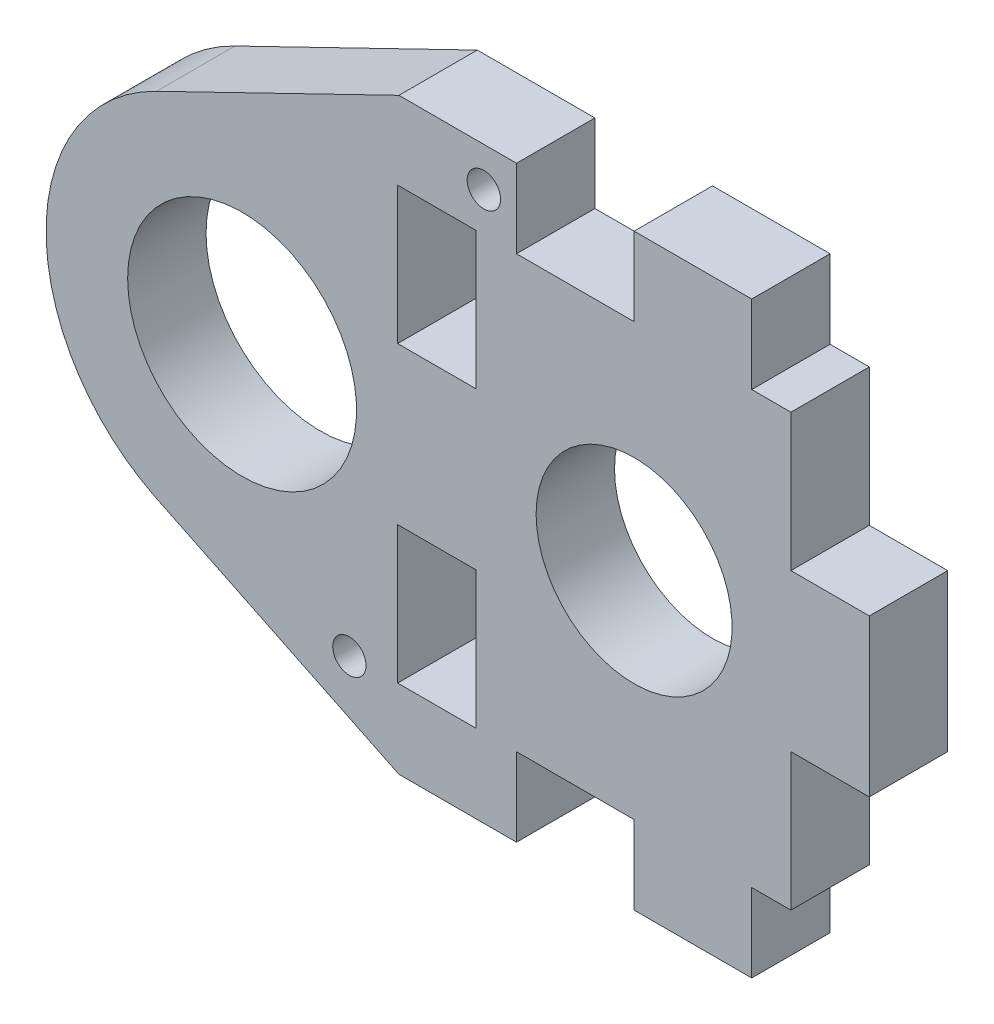
ISO-10303-21;
HEADER;
FILE_DESCRIPTION(('STEP AP214'),'2;1');
FILE_NAME('part.step','',(''),(''),'','','');
FILE_SCHEMA(('AUTOMOTIVE_DESIGN { 1 0 10303 214 1 1 1 1 }'));
ENDSEC;
DATA;
#1=APPLICATION_CONTEXT('core data for automotive mechanical design processes');
#2=APPLICATION_PROTOCOL_DEFINITION('international standard','automotive_design',2000,#1);
#3=PRODUCT_CONTEXT('',#1,'mechanical');
#4=PRODUCT('Part','Part','',(#3));
#5=PRODUCT_RELATED_PRODUCT_CATEGORY('part','',(#4));
#6=PRODUCT_DEFINITION_FORMATION('','',#4);
#7=PRODUCT_DEFINITION_CONTEXT('part definition',#1,'design');
#8=PRODUCT_DEFINITION('design','',#6,#7);
#9=PRODUCT_DEFINITION_SHAPE('','',#8);
#10=(LENGTH_UNIT() NAMED_UNIT(*) SI_UNIT(.MILLI.,.METRE.));
#11=(NAMED_UNIT(*) PLANE_ANGLE_UNIT() SI_UNIT($,.RADIAN.));
#12=(NAMED_UNIT(*) SI_UNIT($,.STERADIAN.) SOLID_ANGLE_UNIT());
#13=UNCERTAINTY_MEASURE_WITH_UNIT(LENGTH_MEASURE(1.E-05),#10,'distance_accuracy_value','');
#14=(GEOMETRIC_REPRESENTATION_CONTEXT(3) GLOBAL_UNCERTAINTY_ASSIGNED_CONTEXT((#13)) GLOBAL_UNIT_ASSIGNED_CONTEXT((#10,
#11,#12)) REPRESENTATION_CONTEXT('',''));
#15=CARTESIAN_POINT('',(0.,0.,0.));
#16=DIRECTION('',(0.,0.,1.));
#17=DIRECTION('',(1.,0.,0.));
#18=AXIS2_PLACEMENT_3D('',#15,#16,#17);
#19=CARTESIAN_POINT('',(-31.75,0.,0.));
#20=DIRECTION('',(0.,0.,1.));
#21=DIRECTION('',(1.,0.,0.));
#22=AXIS2_PLACEMENT_3D('',#19,#20,#21);
#23=PLANE('',#22);
#24=CARTESIAN_POINT('',(-23.0598523625735,-17.5213212412686,0.));
#25=DIRECTION('',(0.,0.,-1.));
#26=DIRECTION('',(-1.,0.,0.));
#27=AXIS2_PLACEMENT_3D('',#24,#25,#26);
#28=CIRCLE('',#27,1.35254999999999);
#29=CARTESIAN_POINT('',(-24.4124023625735,-17.5213212412686,0.));
#30=VERTEX_POINT('',#29);
#31=EDGE_CURVE('E480',#30,#30,#28,.T.);
#32=ORIENTED_EDGE('',*,*,#31,.F.);
#33=EDGE_LOOP('',(#32));
#34=FACE_BOUND('',#33,.T.);
#35=DIRECTION('',(-1.,0.,0.));
#36=VECTOR('',#35,1.);
#37=CARTESIAN_POINT('',(19.05,-6.34999999999999,5.13478148889135E-13));
#38=LINE('',#37,#36);
#39=CARTESIAN_POINT('',(19.05,-6.34999999999999,5.13478148889135E-13));
#40=VERTEX_POINT('',#39);
#41=CARTESIAN_POINT('',(12.7,-6.34999999999999,5.13478148889135E-13));
#42=VERTEX_POINT('',#41);
#43=EDGE_CURVE('E424',#40,#42,#38,.T.);
#44=ORIENTED_EDGE('',*,*,#43,.T.);
#45=DIRECTION('',(0.,1.,0.));
#46=VECTOR('',#45,1.);
#47=CARTESIAN_POINT('',(12.7,0.,0.));
#48=LINE('',#47,#46);
#49=CARTESIAN_POINT('',(12.7,-17.4625,0.));
#50=VERTEX_POINT('',#49);
#51=EDGE_CURVE('E399',#50,#42,#48,.T.);
#52=ORIENTED_EDGE('',*,*,#51,.F.);
#53=DIRECTION('',(1.,0.,0.));
#54=VECTOR('',#53,1.);
#55=CARTESIAN_POINT('',(9.52500000000002,-17.4625,0.));
#56=LINE('',#55,#54);
#57=CARTESIAN_POINT('',(9.52500000000002,-17.4625,0.));
#58=VERTEX_POINT('',#57);
#59=EDGE_CURVE('E349',#58,#50,#56,.T.);
#60=ORIENTED_EDGE('',*,*,#59,.F.);
#61=DIRECTION('',(0.,-1.,0.));
#62=VECTOR('',#61,1.);
#63=CARTESIAN_POINT('',(9.52500000000002,0.,0.));
#64=LINE('',#63,#62);
#65=CARTESIAN_POINT('',(9.52500000000001,-23.8125,0.));
#66=VERTEX_POINT('',#65);
#67=EDGE_CURVE('E272',#58,#66,#64,.T.);
#68=ORIENTED_EDGE('',*,*,#67,.T.);
#69=DIRECTION('',(1.,0.,0.));
#70=VECTOR('',#69,1.);
#71=CARTESIAN_POINT('',(-19.05,-23.8125,0.));
#72=LINE('',#71,#70);
#73=CARTESIAN_POINT('',(0.,-23.8125,0.));
#74=VERTEX_POINT('',#73);
#75=EDGE_CURVE('E292',#74,#66,#72,.T.);
#76=ORIENTED_EDGE('',*,*,#75,.F.);
#77=DIRECTION('',(0.,-1.,0.));
#78=VECTOR('',#77,1.);
#79=CARTESIAN_POINT('',(0.,-30.1625,0.));
#80=LINE('',#79,#78);
#81=CARTESIAN_POINT('',(0.,-17.4625,0.));
#82=VERTEX_POINT('',#81);
#83=EDGE_CURVE('E397',#82,#74,#80,.T.);
#84=ORIENTED_EDGE('',*,*,#83,.F.);
#85=DIRECTION('',(1.,0.,0.));
#86=VECTOR('',#85,1.);
#87=CARTESIAN_POINT('',(-9.52499999999998,-17.4625,0.));
#88=LINE('',#87,#86);
#89=CARTESIAN_POINT('',(-9.52499999999998,-17.4625,0.));
#90=VERTEX_POINT('',#89);
#91=EDGE_CURVE('E393',#90,#82,#88,.T.);
#92=ORIENTED_EDGE('',*,*,#91,.F.);
#93=DIRECTION('',(0.,-1.,0.));
#94=VECTOR('',#93,1.);
#95=CARTESIAN_POINT('',(-9.52499999999998,0.,0.));
#96=LINE('',#95,#94);
#97=CARTESIAN_POINT('',(-9.52499999999999,-23.8125,0.));
#98=VERTEX_POINT('',#97);
#99=EDGE_CURVE('E262',#90,#98,#96,.T.);
#100=ORIENTED_EDGE('',*,*,#99,.T.);
#101=CARTESIAN_POINT('',(-19.05,-23.8125,0.));
#102=VERTEX_POINT('',#101);
#103=EDGE_CURVE('E288',#102,#98,#72,.T.);
#104=ORIENTED_EDGE('',*,*,#103,.F.);
#105=DIRECTION('',(0.899591061172804,-0.436733239699006,0.));
#106=VECTOR('',#105,1.);
#107=CARTESIAN_POINT('',(-19.05,-23.8125,0.));
#108=LINE('',#107,#106);
#109=CARTESIAN_POINT('',(-38.6831401802217,-14.2810080961183,0.));
#110=VERTEX_POINT('',#109);
#111=EDGE_CURVE('E293',#110,#102,#108,.T.);
#112=ORIENTED_EDGE('',*,*,#111,.F.);
#113=CARTESIAN_POINT('',(-31.75,0.,0.));
#114=DIRECTION('',(0.,0.,1.));
#115=DIRECTION('',(1.,0.,0.));
#116=AXIS2_PLACEMENT_3D('',#113,#114,#115);
#117=CIRCLE('',#116,15.875);
#118=CARTESIAN_POINT('',(-38.6831401802217,14.2810080961183,0.));
#119=VERTEX_POINT('',#118);
#120=EDGE_CURVE('E295',#119,#110,#117,.T.);
#121=ORIENTED_EDGE('',*,*,#120,.F.);
#122=DIRECTION('',(-0.899591061172804,-0.436733239699006,0.));
#123=VECTOR('',#122,1.);
#124=CARTESIAN_POINT('',(-19.05,23.8125,0.));
#125=LINE('',#124,#123);
#126=CARTESIAN_POINT('',(-19.05,23.8125,0.));
#127=VERTEX_POINT('',#126);
#128=EDGE_CURVE('E297',#127,#119,#125,.T.);
#129=ORIENTED_EDGE('',*,*,#128,.F.);
#130=DIRECTION('',(-1.,0.,0.));
#131=VECTOR('',#130,1.);
#132=CARTESIAN_POINT('',(-19.05,23.8125,0.));
#133=LINE('',#132,#131);
#134=CARTESIAN_POINT('',(-9.52499999999998,23.8125,0.));
#135=VERTEX_POINT('',#134);
#136=EDGE_CURVE('E302',#135,#127,#133,.T.);
#137=ORIENTED_EDGE('',*,*,#136,.F.);
#138=DIRECTION('',(0.,1.,0.));
#139=VECTOR('',#138,1.);
#140=CARTESIAN_POINT('',(-9.52499999999998,17.4625,0.));
#141=LINE('',#140,#139);
#142=CARTESIAN_POINT('',(-9.52499999999998,17.4625,0.));
#143=VERTEX_POINT('',#142);
#144=EDGE_CURVE('E368',#143,#135,#141,.T.);
#145=ORIENTED_EDGE('',*,*,#144,.F.);
#146=DIRECTION('',(-1.,0.,0.));
#147=VECTOR('',#146,1.);
#148=CARTESIAN_POINT('',(-9.52499999999998,17.4625,0.));
#149=LINE('',#148,#147);
#150=CARTESIAN_POINT('',(0.,17.4625,0.));
#151=VERTEX_POINT('',#150);
#152=EDGE_CURVE('E371',#151,#143,#149,.T.);
#153=ORIENTED_EDGE('',*,*,#152,.F.);
#154=DIRECTION('',(0.,1.,0.));
#155=VECTOR('',#154,1.);
#156=CARTESIAN_POINT('',(0.,0.,0.));
#157=LINE('',#156,#155);
#158=CARTESIAN_POINT('',(0.,23.8125,0.));
#159=VERTEX_POINT('',#158);
#160=EDGE_CURVE('E267',#151,#159,#157,.T.);
#161=ORIENTED_EDGE('',*,*,#160,.T.);
#162=CARTESIAN_POINT('',(9.52500000000002,23.8125,0.));
#163=VERTEX_POINT('',#162);
#164=EDGE_CURVE('E299',#163,#159,#133,.T.);
#165=ORIENTED_EDGE('',*,*,#164,.F.);
#166=DIRECTION('',(0.,1.,0.));
#167=VECTOR('',#166,1.);
#168=CARTESIAN_POINT('',(9.52500000000002,17.4625,0.));
#169=LINE('',#168,#167);
#170=CARTESIAN_POINT('',(9.52500000000002,17.4625,0.));
#171=VERTEX_POINT('',#170);
#172=EDGE_CURVE('E334',#171,#163,#169,.T.);
#173=ORIENTED_EDGE('',*,*,#172,.F.);
#174=DIRECTION('',(-1.,0.,0.));
#175=VECTOR('',#174,1.);
#176=CARTESIAN_POINT('',(9.52500000000002,17.4625,0.));
#177=LINE('',#176,#175);
#178=CARTESIAN_POINT('',(12.7,17.4625,0.));
#179=VERTEX_POINT('',#178);
#180=EDGE_CURVE('E337',#179,#171,#177,.T.);
#181=ORIENTED_EDGE('',*,*,#180,.F.);
#182=CARTESIAN_POINT('',(12.7,6.35000000000001,5.13478148889135E-13));
#183=VERTEX_POINT('',#182);
#184=EDGE_CURVE('E407',#183,#179,#48,.T.);
#185=ORIENTED_EDGE('',*,*,#184,.F.);
#186=DIRECTION('',(-1.,0.,0.));
#187=VECTOR('',#186,1.);
#188=CARTESIAN_POINT('',(19.05,6.35000000000001,5.13478148889135E-13));
#189=LINE('',#188,#187);
#190=CARTESIAN_POINT('',(19.05,6.35000000000001,5.13478148889135E-13));
#191=VERTEX_POINT('',#190);
#192=EDGE_CURVE('E425',#191,#183,#189,.T.);
#193=ORIENTED_EDGE('',*,*,#192,.F.);
#194=DIRECTION('',(0.,1.,0.));
#195=VECTOR('',#194,1.);
#196=CARTESIAN_POINT('',(19.05,-23.8125,0.));
#197=LINE('',#196,#195);
#198=EDGE_CURVE('E303',#40,#191,#197,.T.);
#199=ORIENTED_EDGE('',*,*,#198,.F.);
#200=EDGE_LOOP('',(#44,#52,#60,#68,#76,#84,#92,#100,#104,#112,#121,#129,#137,#145,#153,#161,
#165,#173,#181,#185,#193,#199));
#201=FACE_BOUND('',#200,.T.);
#202=CARTESIAN_POINT('',(-31.75,0.,0.));
#203=DIRECTION('',(0.,0.,-1.));
#204=DIRECTION('',(-1.,0.,0.));
#205=AXIS2_PLACEMENT_3D('',#202,#203,#204);
#206=CIRCLE('',#205,9.271);
#207=CARTESIAN_POINT('',(-41.021,0.,0.));
#208=VERTEX_POINT('',#207);
#209=EDGE_CURVE('E322',#208,#208,#206,.T.);
#210=ORIENTED_EDGE('',*,*,#209,.F.);
#211=EDGE_LOOP('',(#210));
#212=FACE_BOUND('',#211,.T.);
#213=DIRECTION('',(-1.,0.,0.));
#214=VECTOR('',#213,1.);
#215=CARTESIAN_POINT('',(-12.8015999999999,-6.35000000000003,5.55111512312578E-13));
#216=LINE('',#215,#214);
#217=CARTESIAN_POINT('',(-12.8015999999999,-6.35000000000003,5.55111512312578E-13));
#218=VERTEX_POINT('',#217);
#219=CARTESIAN_POINT('',(-19.1515999999999,-6.35000000000004,0.));
#220=VERTEX_POINT('',#219);
#221=EDGE_CURVE('E234',#218,#220,#216,.T.);
#222=ORIENTED_EDGE('',*,*,#221,.T.);
#223=DIRECTION('',(0.,1.,0.));
#224=VECTOR('',#223,1.);
#225=CARTESIAN_POINT('',(-19.1515999999999,0.,0.));
#226=LINE('',#225,#224);
#227=CARTESIAN_POINT('',(-19.1515999999999,-17.4625,0.));
#228=VERTEX_POINT('',#227);
#229=EDGE_CURVE('E11',#228,#220,#226,.T.);
#230=ORIENTED_EDGE('',*,*,#229,.F.);
#231=DIRECTION('',(-1.,0.,0.));
#232=VECTOR('',#231,1.);
#233=CARTESIAN_POINT('',(-31.75,-17.4625,0.));
#234=LINE('',#233,#232);
#235=CARTESIAN_POINT('',(-12.8015999999999,-17.4625,0.));
#236=VERTEX_POINT('',#235);
#237=EDGE_CURVE('E43',#236,#228,#234,.T.);
#238=ORIENTED_EDGE('',*,*,#237,.F.);
#239=DIRECTION('',(0.,1.,0.));
#240=VECTOR('',#239,1.);
#241=CARTESIAN_POINT('',(-12.8015999999999,0.,0.));
#242=LINE('',#241,#240);
#243=EDGE_CURVE('E247',#236,#218,#242,.T.);
#244=ORIENTED_EDGE('',*,*,#243,.T.);
#245=EDGE_LOOP('',(#222,#230,#238,#244));
#246=FACE_BOUND('',#245,.T.);
#247=CARTESIAN_POINT('',(-19.1515999999999,6.34999999999996,5.55111512312578E-13));
#248=VERTEX_POINT('',#247);
#249=CARTESIAN_POINT('',(-19.1515999999999,17.4625,0.));
#250=VERTEX_POINT('',#249);
#251=EDGE_CURVE('E45',#248,#250,#226,.T.);
#252=ORIENTED_EDGE('',*,*,#251,.F.);
#253=DIRECTION('',(-1.,0.,0.));
#254=VECTOR('',#253,1.);
#255=CARTESIAN_POINT('',(-12.8015999999999,6.34999999999997,5.55111512312578E-13));
#256=LINE('',#255,#254);
#257=CARTESIAN_POINT('',(-12.8015999999999,6.34999999999997,0.));
#258=VERTEX_POINT('',#257);
#259=EDGE_CURVE('E244',#258,#248,#256,.T.);
#260=ORIENTED_EDGE('',*,*,#259,.F.);
#261=CARTESIAN_POINT('',(-12.8015999999999,17.4625,0.));
#262=VERTEX_POINT('',#261);
#263=EDGE_CURVE('E254',#258,#262,#242,.T.);
#264=ORIENTED_EDGE('',*,*,#263,.T.);
#265=DIRECTION('',(1.,0.,0.));
#266=VECTOR('',#265,1.);
#267=CARTESIAN_POINT('',(-31.75,17.4625,0.));
#268=LINE('',#267,#266);
#269=EDGE_CURVE('E252',#250,#262,#268,.T.);
#270=ORIENTED_EDGE('',*,*,#269,.F.);
#271=EDGE_LOOP('',(#252,#260,#264,#270));
#272=FACE_BOUND('',#271,.T.);
#273=CARTESIAN_POINT('',(0.,0.,0.));
#274=DIRECTION('',(0.,0.,-1.));
#275=DIRECTION('',(-1.,0.,0.));
#276=AXIS2_PLACEMENT_3D('',#273,#274,#275);
#277=CIRCLE('',#276,7.9375);
#278=CARTESIAN_POINT('',(-7.93749999999998,0.,0.));
#279=VERTEX_POINT('',#278);
#280=EDGE_CURVE('E469',#279,#279,#277,.T.);
#281=ORIENTED_EDGE('',*,*,#280,.F.);
#282=EDGE_LOOP('',(#281));
#283=FACE_BOUND('',#282,.T.);
#284=CARTESIAN_POINT('',(-12.169849394093,20.6375,0.));
#285=DIRECTION('',(0.,0.,-1.));
#286=DIRECTION('',(-1.,0.,0.));
#287=AXIS2_PLACEMENT_3D('',#284,#285,#286);
#288=CIRCLE('',#287,1.35254999999999);
#289=CARTESIAN_POINT('',(-13.522399394093,20.6375,0.));
#290=VERTEX_POINT('',#289);
#291=EDGE_CURVE('E477',#290,#290,#288,.T.);
#292=ORIENTED_EDGE('',*,*,#291,.F.);
#293=EDGE_LOOP('',(#292));
#294=FACE_BOUND('',#293,.T.);
#295=ADVANCED_FACE('F34',(#34,#201,#212,#246,#272,#283,#294),#23,.F.);
#296=CARTESIAN_POINT('',(-31.75,0.,6.35));
#297=DIRECTION('',(0.,0.,1.));
#298=DIRECTION('',(1.,0.,0.));
#299=AXIS2_PLACEMENT_3D('',#296,#297,#298);
#300=PLANE('',#299);
#301=CARTESIAN_POINT('',(-23.0598523625735,-17.5213212412686,6.35));
#302=DIRECTION('',(0.,0.,1.));
#303=DIRECTION('',(1.,0.,0.));
#304=AXIS2_PLACEMENT_3D('',#301,#302,#303);
#305=CIRCLE('',#304,1.35254999999998);
#306=CARTESIAN_POINT('',(-21.7073023625735,-17.5213212412686,6.35));
#307=VERTEX_POINT('',#306);
#308=EDGE_CURVE('E38',#307,#307,#305,.T.);
#309=ORIENTED_EDGE('',*,*,#308,.F.);
#310=EDGE_LOOP('',(#309));
#311=FACE_BOUND('',#310,.T.);
#312=CARTESIAN_POINT('',(-12.169849394093,20.6375,6.35));
#313=DIRECTION('',(0.,0.,1.));
#314=DIRECTION('',(1.,0.,0.));
#315=AXIS2_PLACEMENT_3D('',#312,#313,#314);
#316=CIRCLE('',#315,1.35254999999998);
#317=CARTESIAN_POINT('',(-10.817299394093,20.6375,6.35));
#318=VERTEX_POINT('',#317);
#319=EDGE_CURVE('E472',#318,#318,#316,.T.);
#320=ORIENTED_EDGE('',*,*,#319,.F.);
#321=EDGE_LOOP('',(#320));
#322=FACE_BOUND('',#321,.T.);
#323=CARTESIAN_POINT('',(0.,0.,6.35000000000056));
#324=DIRECTION('',(0.,0.,-1.));
#325=DIRECTION('',(-1.,0.,0.));
#326=AXIS2_PLACEMENT_3D('',#323,#324,#325);
#327=CIRCLE('',#326,7.9375);
#328=CARTESIAN_POINT('',(-7.93749999999998,0.,6.35000000000056));
#329=VERTEX_POINT('',#328);
#330=EDGE_CURVE('E467',#329,#329,#327,.T.);
#331=ORIENTED_EDGE('',*,*,#330,.T.);
#332=EDGE_LOOP('',(#331));
#333=FACE_BOUND('',#332,.T.);
#334=DIRECTION('',(0.,1.,0.));
#335=VECTOR('',#334,1.);
#336=CARTESIAN_POINT('',(-19.1515999999999,-17.4625,6.35000000000056));
#337=LINE('',#336,#335);
#338=CARTESIAN_POINT('',(-19.1515999999999,6.34999999999996,6.35));
#339=VERTEX_POINT('',#338);
#340=CARTESIAN_POINT('',(-19.1515999999999,17.4625,6.35000000000056));
#341=VERTEX_POINT('',#340);
#342=EDGE_CURVE('E60',#339,#341,#337,.T.);
#343=ORIENTED_EDGE('',*,*,#342,.T.);
#344=DIRECTION('',(1.,0.,0.));
#345=VECTOR('',#344,1.);
#346=CARTESIAN_POINT('',(-19.1515999999999,17.4625,6.35000000000056));
#347=LINE('',#346,#345);
#348=CARTESIAN_POINT('',(-12.8015999999999,17.4625,6.35000000000056));
#349=VERTEX_POINT('',#348);
#350=EDGE_CURVE('E438',#341,#349,#347,.T.);
#351=ORIENTED_EDGE('',*,*,#350,.T.);
#352=DIRECTION('',(0.,1.,0.));
#353=VECTOR('',#352,1.);
#354=CARTESIAN_POINT('',(-12.8015999999999,-17.4625,6.35000000000056));
#355=LINE('',#354,#353);
#356=CARTESIAN_POINT('',(-12.8015999999999,6.34999999999997,6.35000000000056));
#357=VERTEX_POINT('',#356);
#358=EDGE_CURVE('E451',#357,#349,#355,.T.);
#359=ORIENTED_EDGE('',*,*,#358,.F.);
#360=DIRECTION('',(1.,0.,0.));
#361=VECTOR('',#360,1.);
#362=CARTESIAN_POINT('',(-19.1515999999999,6.34999999999997,6.35000000000056));
#363=LINE('',#362,#361);
#364=EDGE_CURVE('E243',#339,#357,#363,.T.);
#365=ORIENTED_EDGE('',*,*,#364,.F.);
#366=EDGE_LOOP('',(#343,#351,#359,#365));
#367=FACE_BOUND('',#366,.T.);
#368=CARTESIAN_POINT('',(-31.75,0.,6.35));
#369=DIRECTION('',(0.,0.,-1.));
#370=DIRECTION('',(-1.,0.,0.));
#371=AXIS2_PLACEMENT_3D('',#368,#369,#370);
#372=CIRCLE('',#371,9.271);
#373=CARTESIAN_POINT('',(-41.021,0.,6.35));
#374=VERTEX_POINT('',#373);
#375=EDGE_CURVE('E306',#374,#374,#372,.T.);
#376=ORIENTED_EDGE('',*,*,#375,.T.);
#377=EDGE_LOOP('',(#376));
#378=FACE_BOUND('',#377,.T.);
#379=DIRECTION('',(1.,0.,0.));
#380=VECTOR('',#379,1.);
#381=CARTESIAN_POINT('',(9.52500000000002,-17.4625,6.35));
#382=LINE('',#381,#380);
#383=CARTESIAN_POINT('',(9.52500000000002,-17.4625,6.35));
#384=VERTEX_POINT('',#383);
#385=CARTESIAN_POINT('',(12.7000000000001,-17.4625,6.35));
#386=VERTEX_POINT('',#385);
#387=EDGE_CURVE('E348',#384,#386,#382,.T.);
#388=ORIENTED_EDGE('',*,*,#387,.T.);
#389=DIRECTION('',(0.,1.,0.));
#390=VECTOR('',#389,1.);
#391=CARTESIAN_POINT('',(12.7,-17.4625,6.35000000000052));
#392=LINE('',#391,#390);
#393=CARTESIAN_POINT('',(12.7,-6.34999999999999,6.35000000000052));
#394=VERTEX_POINT('',#393);
#395=EDGE_CURVE('E415',#386,#394,#392,.T.);
#396=ORIENTED_EDGE('',*,*,#395,.T.);
#397=DIRECTION('',(-1.,0.,0.));
#398=VECTOR('',#397,1.);
#399=CARTESIAN_POINT('',(12.7,-6.34999999999999,6.35000000000052));
#400=LINE('',#399,#398);
#401=CARTESIAN_POINT('',(19.05,-6.34999999999999,6.35000000000052));
#402=VERTEX_POINT('',#401);
#403=EDGE_CURVE('E419',#402,#394,#400,.T.);
#404=ORIENTED_EDGE('',*,*,#403,.F.);
#405=DIRECTION('',(0.,1.,0.));
#406=VECTOR('',#405,1.);
#407=CARTESIAN_POINT('',(19.05,-23.8125,6.35));
#408=LINE('',#407,#406);
#409=CARTESIAN_POINT('',(19.05,6.35000000000001,6.35000000000052));
#410=VERTEX_POINT('',#409);
#411=EDGE_CURVE('E291',#402,#410,#408,.T.);
#412=ORIENTED_EDGE('',*,*,#411,.T.);
#413=DIRECTION('',(1.,0.,0.));
#414=VECTOR('',#413,1.);
#415=CARTESIAN_POINT('',(12.7,6.35000000000001,6.35000000000052));
#416=LINE('',#415,#414);
#417=CARTESIAN_POINT('',(12.7,6.35000000000001,6.35000000000052));
#418=VERTEX_POINT('',#417);
#419=EDGE_CURVE('E422',#418,#410,#416,.T.);
#420=ORIENTED_EDGE('',*,*,#419,.F.);
#421=CARTESIAN_POINT('',(12.7,17.4625,6.35000000000052));
#422=VERTEX_POINT('',#421);
#423=EDGE_CURVE('E418',#418,#422,#392,.T.);
#424=ORIENTED_EDGE('',*,*,#423,.T.);
#425=DIRECTION('',(-1.,0.,0.));
#426=VECTOR('',#425,1.);
#427=CARTESIAN_POINT('',(9.52500000000002,17.4625,6.35));
#428=LINE('',#427,#426);
#429=CARTESIAN_POINT('',(9.52500000000002,17.4625,6.35));
#430=VERTEX_POINT('',#429);
#431=EDGE_CURVE('E336',#422,#430,#428,.T.);
#432=ORIENTED_EDGE('',*,*,#431,.T.);
#433=DIRECTION('',(0.,1.,0.));
#434=VECTOR('',#433,1.);
#435=CARTESIAN_POINT('',(9.52500000000002,17.4625,6.35));
#436=LINE('',#435,#434);
#437=CARTESIAN_POINT('',(9.52500000000002,23.8125,6.35));
#438=VERTEX_POINT('',#437);
#439=EDGE_CURVE('E333',#430,#438,#436,.T.);
#440=ORIENTED_EDGE('',*,*,#439,.T.);
#441=DIRECTION('',(-1.,0.,0.));
#442=VECTOR('',#441,1.);
#443=CARTESIAN_POINT('',(-19.05,23.8125,6.35));
#444=LINE('',#443,#442);
#445=CARTESIAN_POINT('',(0.,23.8125,6.35));
#446=VERTEX_POINT('',#445);
#447=EDGE_CURVE('E316',#438,#446,#444,.T.);
#448=ORIENTED_EDGE('',*,*,#447,.T.);
#449=DIRECTION('',(0.,-1.,0.));
#450=VECTOR('',#449,1.);
#451=CARTESIAN_POINT('',(0.,17.4625,6.35));
#452=LINE('',#451,#450);
#453=CARTESIAN_POINT('',(0.,17.4625,6.35));
#454=VERTEX_POINT('',#453);
#455=EDGE_CURVE('E370',#446,#454,#452,.T.);
#456=ORIENTED_EDGE('',*,*,#455,.T.);
#457=DIRECTION('',(-1.,0.,0.));
#458=VECTOR('',#457,1.);
#459=CARTESIAN_POINT('',(-9.52499999999998,17.4625,6.35));
#460=LINE('',#459,#458);
#461=CARTESIAN_POINT('',(-9.52499999999998,17.4625,6.35));
#462=VERTEX_POINT('',#461);
#463=EDGE_CURVE('E377',#454,#462,#460,.T.);
#464=ORIENTED_EDGE('',*,*,#463,.T.);
#465=DIRECTION('',(0.,1.,0.));
#466=VECTOR('',#465,1.);
#467=CARTESIAN_POINT('',(-9.52499999999998,17.4625,6.35));
#468=LINE('',#467,#466);
#469=CARTESIAN_POINT('',(-9.52499999999998,23.8125,6.35));
#470=VERTEX_POINT('',#469);
#471=EDGE_CURVE('E366',#462,#470,#468,.T.);
#472=ORIENTED_EDGE('',*,*,#471,.T.);
#473=CARTESIAN_POINT('',(-19.05,23.8125,6.35));
#474=VERTEX_POINT('',#473);
#475=EDGE_CURVE('E319',#470,#474,#444,.T.);
#476=ORIENTED_EDGE('',*,*,#475,.T.);
#477=DIRECTION('',(-0.899591061172804,-0.436733239699006,0.));
#478=VECTOR('',#477,1.);
#479=CARTESIAN_POINT('',(-19.05,23.8125,6.35));
#480=LINE('',#479,#478);
#481=CARTESIAN_POINT('',(-38.6831401802217,14.2810080961183,6.35));
#482=VERTEX_POINT('',#481);
#483=EDGE_CURVE('E314',#474,#482,#480,.T.);
#484=ORIENTED_EDGE('',*,*,#483,.T.);
#485=CARTESIAN_POINT('',(-31.75,0.,6.35));
#486=DIRECTION('',(0.,0.,1.));
#487=DIRECTION('',(1.,0.,0.));
#488=AXIS2_PLACEMENT_3D('',#485,#486,#487);
#489=CIRCLE('',#488,15.875);
#490=CARTESIAN_POINT('',(-38.6831401802217,-14.2810080961183,6.35));
#491=VERTEX_POINT('',#490);
#492=EDGE_CURVE('E312',#482,#491,#489,.T.);
#493=ORIENTED_EDGE('',*,*,#492,.T.);
#494=DIRECTION('',(0.899591061172804,-0.436733239699006,0.));
#495=VECTOR('',#494,1.);
#496=CARTESIAN_POINT('',(-19.05,-23.8125,6.35));
#497=LINE('',#496,#495);
#498=CARTESIAN_POINT('',(-19.05,-23.8125,6.35));
#499=VERTEX_POINT('',#498);
#500=EDGE_CURVE('E310',#491,#499,#497,.T.);
#501=ORIENTED_EDGE('',*,*,#500,.T.);
#502=DIRECTION('',(1.,0.,0.));
#503=VECTOR('',#502,1.);
#504=CARTESIAN_POINT('',(-19.05,-23.8125,6.35));
#505=LINE('',#504,#503);
#506=CARTESIAN_POINT('',(-9.52499999999998,-23.8125,6.35));
#507=VERTEX_POINT('',#506);
#508=EDGE_CURVE('E287',#499,#507,#505,.T.);
#509=ORIENTED_EDGE('',*,*,#508,.T.);
#510=DIRECTION('',(0.,1.,0.));
#511=VECTOR('',#510,1.);
#512=CARTESIAN_POINT('',(-9.52499999999998,-30.1625,6.35));
#513=LINE('',#512,#511);
#514=CARTESIAN_POINT('',(-9.52499999999998,-17.4625,6.35));
#515=VERTEX_POINT('',#514);
#516=EDGE_CURVE('E402',#507,#515,#513,.T.);
#517=ORIENTED_EDGE('',*,*,#516,.T.);
#518=DIRECTION('',(1.,0.,0.));
#519=VECTOR('',#518,1.);
#520=CARTESIAN_POINT('',(-9.52499999999998,-17.4625,6.35));
#521=LINE('',#520,#519);
#522=CARTESIAN_POINT('',(0.,-17.4625,6.35));
#523=VERTEX_POINT('',#522);
#524=EDGE_CURVE('E391',#515,#523,#521,.T.);
#525=ORIENTED_EDGE('',*,*,#524,.T.);
#526=DIRECTION('',(0.,-1.,0.));
#527=VECTOR('',#526,1.);
#528=CARTESIAN_POINT('',(0.,-30.1625,6.35));
#529=LINE('',#528,#527);
#530=CARTESIAN_POINT('',(0.,-23.8125,6.35));
#531=VERTEX_POINT('',#530);
#532=EDGE_CURVE('E396',#523,#531,#529,.T.);
#533=ORIENTED_EDGE('',*,*,#532,.T.);
#534=CARTESIAN_POINT('',(9.52500000000002,-23.8125,6.35));
#535=VERTEX_POINT('',#534);
#536=EDGE_CURVE('E309',#531,#535,#505,.T.);
#537=ORIENTED_EDGE('',*,*,#536,.T.);
#538=DIRECTION('',(0.,1.,0.));
#539=VECTOR('',#538,1.);
#540=CARTESIAN_POINT('',(9.52500000000002,-30.1625,6.35));
#541=LINE('',#540,#539);
#542=EDGE_CURVE('E352',#535,#384,#541,.T.);
#543=ORIENTED_EDGE('',*,*,#542,.T.);
#544=EDGE_LOOP('',(#388,#396,#404,#412,#420,#424,#432,#440,#448,#456,#464,#472,#476,#484,#493,
#501,#509,#517,#525,#533,#537,#543));
#545=FACE_BOUND('',#544,.T.);
#546=CARTESIAN_POINT('',(-12.8015999999999,-17.4625,6.35000000000056));
#547=VERTEX_POINT('',#546);
#548=CARTESIAN_POINT('',(-12.8015999999999,-6.35000000000003,6.35));
#549=VERTEX_POINT('',#548);
#550=EDGE_CURVE('E52',#547,#549,#355,.T.);
#551=ORIENTED_EDGE('',*,*,#550,.F.);
#552=DIRECTION('',(1.,0.,0.));
#553=VECTOR('',#552,1.);
#554=CARTESIAN_POINT('',(-19.1515999999999,-17.4625,6.35000000000056));
#555=LINE('',#554,#553);
#556=CARTESIAN_POINT('',(-19.1515999999999,-17.4625,6.35000000000056));
#557=VERTEX_POINT('',#556);
#558=EDGE_CURVE('E441',#557,#547,#555,.T.);
#559=ORIENTED_EDGE('',*,*,#558,.F.);
#560=CARTESIAN_POINT('',(-19.1515999999999,-6.35000000000004,6.35000000000056));
#561=VERTEX_POINT('',#560);
#562=EDGE_CURVE('E456',#557,#561,#337,.T.);
#563=ORIENTED_EDGE('',*,*,#562,.T.);
#564=DIRECTION('',(-1.,0.,0.));
#565=VECTOR('',#564,1.);
#566=CARTESIAN_POINT('',(-19.1515999999999,-6.35000000000004,6.35000000000056));
#567=LINE('',#566,#565);
#568=EDGE_CURVE('E459',#549,#561,#567,.T.);
#569=ORIENTED_EDGE('',*,*,#568,.F.);
#570=EDGE_LOOP('',(#551,#559,#563,#569));
#571=FACE_BOUND('',#570,.T.);
#572=ADVANCED_FACE('F489',(#311,#322,#333,#367,#378,#545,#571),#300,.T.);
#573=CARTESIAN_POINT('',(19.05,-23.8125,6.35));
#574=DIRECTION('',(-1.,0.,0.));
#575=DIRECTION('',(0.,-1.,0.));
#576=AXIS2_PLACEMENT_3D('',#573,#574,#575);
#577=PLANE('',#576);
#578=DIRECTION('',(0.,0.,1.));
#579=VECTOR('',#578,1.);
#580=CARTESIAN_POINT('',(19.05,-6.34999999999999,5.13478148889135E-13));
#581=LINE('',#580,#579);
#582=EDGE_CURVE('E428',#40,#402,#581,.T.);
#583=ORIENTED_EDGE('',*,*,#582,.F.);
#584=ORIENTED_EDGE('',*,*,#198,.T.);
#585=DIRECTION('',(0.,0.,1.));
#586=VECTOR('',#585,1.);
#587=CARTESIAN_POINT('',(19.05,6.35000000000001,-69.8499999999995));
#588=LINE('',#587,#586);
#589=EDGE_CURVE('E409',#191,#410,#588,.T.);
#590=ORIENTED_EDGE('',*,*,#589,.T.);
#591=ORIENTED_EDGE('',*,*,#411,.F.);
#592=EDGE_LOOP('',(#583,#584,#590,#591));
#593=FACE_BOUND('',#592,.T.);
#594=ADVANCED_FACE('F36',(#593),#577,.F.);
#595=CARTESIAN_POINT('',(9.52500000000002,17.4625,6.35));
#596=DIRECTION('',(0.,-1.,0.));
#597=DIRECTION('',(1.,0.,0.));
#598=AXIS2_PLACEMENT_3D('',#595,#596,#597);
#599=PLANE('',#598);
#600=DIRECTION('',(0.,0.,-1.));
#601=VECTOR('',#600,1.);
#602=CARTESIAN_POINT('',(12.7,17.4625,-146.049999999999));
#603=LINE('',#602,#601);
#604=EDGE_CURVE('E412',#422,#179,#603,.T.);
#605=ORIENTED_EDGE('',*,*,#604,.T.);
#606=ORIENTED_EDGE('',*,*,#180,.T.);
#607=DIRECTION('',(0.,0.,-1.));
#608=VECTOR('',#607,1.);
#609=CARTESIAN_POINT('',(9.52500000000002,17.4625,6.35));
#610=LINE('',#609,#608);
#611=EDGE_CURVE('E330',#430,#171,#610,.T.);
#612=ORIENTED_EDGE('',*,*,#611,.F.);
#613=ORIENTED_EDGE('',*,*,#431,.F.);
#614=EDGE_LOOP('',(#605,#606,#612,#613));
#615=FACE_BOUND('',#614,.T.);
#616=ADVANCED_FACE('F596',(#615),#599,.F.);
#617=CARTESIAN_POINT('',(9.52500000000002,-17.4625,6.35));
#618=DIRECTION('',(0.,1.,0.));
#619=DIRECTION('',(-1.,0.,0.));
#620=AXIS2_PLACEMENT_3D('',#617,#618,#619);
#621=PLANE('',#620);
#622=DIRECTION('',(0.,0.,-1.));
#623=VECTOR('',#622,1.);
#624=CARTESIAN_POINT('',(12.7000000000001,-17.4625,6.35));
#625=LINE('',#624,#623);
#626=EDGE_CURVE('E258',#386,#50,#625,.T.);
#627=ORIENTED_EDGE('',*,*,#626,.F.);
#628=ORIENTED_EDGE('',*,*,#387,.F.);
#629=DIRECTION('',(0.,0.,-1.));
#630=VECTOR('',#629,1.);
#631=CARTESIAN_POINT('',(9.52500000000002,-17.4625,6.35));
#632=LINE('',#631,#630);
#633=EDGE_CURVE('E345',#384,#58,#632,.T.);
#634=ORIENTED_EDGE('',*,*,#633,.T.);
#635=ORIENTED_EDGE('',*,*,#59,.T.);
#636=EDGE_LOOP('',(#627,#628,#634,#635));
#637=FACE_BOUND('',#636,.T.);
#638=ADVANCED_FACE('F594',(#637),#621,.F.);
#639=CARTESIAN_POINT('',(-19.05,-23.8125,6.35));
#640=DIRECTION('',(0.,1.,0.));
#641=DIRECTION('',(-1.,0.,0.));
#642=AXIS2_PLACEMENT_3D('',#639,#640,#641);
#643=PLANE('',#642);
#644=ORIENTED_EDGE('',*,*,#536,.F.);
#645=DIRECTION('',(0.,0.,-1.));
#646=VECTOR('',#645,1.);
#647=CARTESIAN_POINT('',(0.,-23.8125,6.35));
#648=LINE('',#647,#646);
#649=EDGE_CURVE('E374',#531,#74,#648,.T.);
#650=ORIENTED_EDGE('',*,*,#649,.T.);
#651=ORIENTED_EDGE('',*,*,#75,.T.);
#652=DIRECTION('',(0.,0.,1.));
#653=VECTOR('',#652,1.);
#654=CARTESIAN_POINT('',(9.52500000000002,-23.8125,6.35));
#655=LINE('',#654,#653);
#656=EDGE_CURVE('E339',#66,#535,#655,.T.);
#657=ORIENTED_EDGE('',*,*,#656,.T.);
#658=EDGE_LOOP('',(#644,#650,#651,#657));
#659=FACE_BOUND('',#658,.T.);
#660=ADVANCED_FACE('F536',(#659),#643,.F.);
#661=CARTESIAN_POINT('',(-19.05,23.8125,6.35));
#662=DIRECTION('',(0.,-1.,0.));
#663=DIRECTION('',(0.,0.,-1.));
#664=AXIS2_PLACEMENT_3D('',#661,#662,#663);
#665=PLANE('',#664);
#666=ORIENTED_EDGE('',*,*,#164,.T.);
#667=DIRECTION('',(0.,0.,1.));
#668=VECTOR('',#667,1.);
#669=CARTESIAN_POINT('',(0.,23.8125,6.35));
#670=LINE('',#669,#668);
#671=EDGE_CURVE('E353',#159,#446,#670,.T.);
#672=ORIENTED_EDGE('',*,*,#671,.T.);
#673=ORIENTED_EDGE('',*,*,#447,.F.);
#674=DIRECTION('',(0.,0.,-1.));
#675=VECTOR('',#674,1.);
#676=CARTESIAN_POINT('',(9.52500000000002,23.8125,6.35));
#677=LINE('',#676,#675);
#678=EDGE_CURVE('E325',#438,#163,#677,.T.);
#679=ORIENTED_EDGE('',*,*,#678,.T.);
#680=EDGE_LOOP('',(#666,#672,#673,#679));
#681=FACE_BOUND('',#680,.T.);
#682=ADVANCED_FACE('F549',(#681),#665,.F.);
#683=ORIENTED_EDGE('',*,*,#475,.F.);
#684=DIRECTION('',(0.,0.,-1.));
#685=VECTOR('',#684,1.);
#686=CARTESIAN_POINT('',(-9.52499999999998,23.8125,6.35));
#687=LINE('',#686,#685);
#688=EDGE_CURVE('E360',#470,#135,#687,.T.);
#689=ORIENTED_EDGE('',*,*,#688,.T.);
#690=ORIENTED_EDGE('',*,*,#136,.T.);
#691=DIRECTION('',(0.,0.,-1.));
#692=VECTOR('',#691,1.);
#693=CARTESIAN_POINT('',(-19.05,23.8125,6.35));
#694=LINE('',#693,#692);
#695=EDGE_CURVE('E275',#474,#127,#694,.T.);
#696=ORIENTED_EDGE('',*,*,#695,.F.);
#697=EDGE_LOOP('',(#683,#689,#690,#696));
#698=FACE_BOUND('',#697,.T.);
#699=ADVANCED_FACE('F546',(#698),#665,.F.);
#700=CARTESIAN_POINT('',(-19.05,23.8125,6.35));
#701=DIRECTION('',(0.436733239699006,-0.899591061172803,0.));
#702=DIRECTION('',(0.899591061172803,0.436733239699006,0.));
#703=AXIS2_PLACEMENT_3D('',#700,#701,#702);
#704=PLANE('',#703);
#705=ORIENTED_EDGE('',*,*,#128,.T.);
#706=DIRECTION('',(0.,0.,-1.));
#707=VECTOR('',#706,1.);
#708=CARTESIAN_POINT('',(-38.6831401802217,14.2810080961183,6.35));
#709=LINE('',#708,#707);
#710=EDGE_CURVE('E278',#482,#119,#709,.T.);
#711=ORIENTED_EDGE('',*,*,#710,.F.);
#712=ORIENTED_EDGE('',*,*,#483,.F.);
#713=ORIENTED_EDGE('',*,*,#695,.T.);
#714=EDGE_LOOP('',(#705,#711,#712,#713));
#715=FACE_BOUND('',#714,.T.);
#716=ADVANCED_FACE('F543',(#715),#704,.F.);
#717=CARTESIAN_POINT('',(-31.75,0.,6.35));
#718=DIRECTION('',(0.,0.,-1.));
#719=DIRECTION('',(-1.,0.,0.));
#720=AXIS2_PLACEMENT_3D('',#717,#718,#719);
#721=CYLINDRICAL_SURFACE('',#720,15.875);
#722=ORIENTED_EDGE('',*,*,#120,.T.);
#723=DIRECTION('',(0.,0.,-1.));
#724=VECTOR('',#723,1.);
#725=CARTESIAN_POINT('',(-38.6831401802217,-14.2810080961183,6.35));
#726=LINE('',#725,#724);
#727=EDGE_CURVE('E281',#491,#110,#726,.T.);
#728=ORIENTED_EDGE('',*,*,#727,.F.);
#729=ORIENTED_EDGE('',*,*,#492,.F.);
#730=ORIENTED_EDGE('',*,*,#710,.T.);
#731=EDGE_LOOP('',(#722,#728,#729,#730));
#732=FACE_BOUND('',#731,.T.);
#733=ADVANCED_FACE('F539',(#732),#721,.T.);
#734=CARTESIAN_POINT('',(-19.05,-23.8125,6.35));
#735=DIRECTION('',(0.436733239699006,0.899591061172804,0.));
#736=DIRECTION('',(-0.899591061172804,0.436733239699006,0.));
#737=AXIS2_PLACEMENT_3D('',#734,#735,#736);
#738=PLANE('',#737);
#739=ORIENTED_EDGE('',*,*,#111,.T.);
#740=DIRECTION('',(0.,0.,-1.));
#741=VECTOR('',#740,1.);
#742=CARTESIAN_POINT('',(-19.05,-23.8125,6.35));
#743=LINE('',#742,#741);
#744=EDGE_CURVE('E284',#499,#102,#743,.T.);
#745=ORIENTED_EDGE('',*,*,#744,.F.);
#746=ORIENTED_EDGE('',*,*,#500,.F.);
#747=ORIENTED_EDGE('',*,*,#727,.T.);
#748=EDGE_LOOP('',(#739,#745,#746,#747));
#749=FACE_BOUND('',#748,.T.);
#750=ADVANCED_FACE('F534',(#749),#738,.F.);
#751=ORIENTED_EDGE('',*,*,#103,.T.);
#752=DIRECTION('',(0.,0.,1.));
#753=VECTOR('',#752,1.);
#754=CARTESIAN_POINT('',(-9.52499999999998,-23.8125,6.35));
#755=LINE('',#754,#753);
#756=EDGE_CURVE('E384',#98,#507,#755,.T.);
#757=ORIENTED_EDGE('',*,*,#756,.T.);
#758=ORIENTED_EDGE('',*,*,#508,.F.);
#759=ORIENTED_EDGE('',*,*,#744,.T.);
#760=EDGE_LOOP('',(#751,#757,#758,#759));
#761=FACE_BOUND('',#760,.T.);
#762=ADVANCED_FACE('F530',(#761),#643,.F.);
#763=CARTESIAN_POINT('',(-31.75,0.,6.35));
#764=DIRECTION('',(0.,0.,-1.));
#765=DIRECTION('',(-1.,0.,0.));
#766=AXIS2_PLACEMENT_3D('',#763,#764,#765);
#767=CYLINDRICAL_SURFACE('',#766,9.271);
#768=ORIENTED_EDGE('',*,*,#375,.F.);
#769=EDGE_LOOP('',(#768));
#770=FACE_BOUND('',#769,.T.);
#771=ORIENTED_EDGE('',*,*,#209,.T.);
#772=EDGE_LOOP('',(#771));
#773=FACE_BOUND('',#772,.T.);
#774=ADVANCED_FACE('F533',(#770,#773),#767,.F.);
#775=CARTESIAN_POINT('',(9.52500000000002,17.4625,6.35));
#776=DIRECTION('',(-1.,0.,0.));
#777=DIRECTION('',(0.,0.,1.));
#778=AXIS2_PLACEMENT_3D('',#775,#776,#777);
#779=PLANE('',#778);
#780=ORIENTED_EDGE('',*,*,#439,.F.);
#781=ORIENTED_EDGE('',*,*,#611,.T.);
#782=ORIENTED_EDGE('',*,*,#172,.T.);
#783=ORIENTED_EDGE('',*,*,#678,.F.);
#784=EDGE_LOOP('',(#780,#781,#782,#783));
#785=FACE_BOUND('',#784,.T.);
#786=ADVANCED_FACE('F610',(#785),#779,.F.);
#787=CARTESIAN_POINT('',(9.52500000000002,-30.1625,6.35));
#788=DIRECTION('',(-1.,0.,0.));
#789=DIRECTION('',(0.,0.,1.));
#790=AXIS2_PLACEMENT_3D('',#787,#788,#789);
#791=PLANE('',#790);
#792=ORIENTED_EDGE('',*,*,#67,.F.);
#793=ORIENTED_EDGE('',*,*,#633,.F.);
#794=ORIENTED_EDGE('',*,*,#542,.F.);
#795=ORIENTED_EDGE('',*,*,#656,.F.);
#796=EDGE_LOOP('',(#792,#793,#794,#795));
#797=FACE_BOUND('',#796,.T.);
#798=ADVANCED_FACE('F591',(#797),#791,.F.);
#799=CARTESIAN_POINT('',(0.,17.4625,6.35));
#800=DIRECTION('',(1.,0.,0.));
#801=DIRECTION('',(0.,1.,0.));
#802=AXIS2_PLACEMENT_3D('',#799,#800,#801);
#803=PLANE('',#802);
#804=ORIENTED_EDGE('',*,*,#160,.F.);
#805=DIRECTION('',(0.,0.,-1.));
#806=VECTOR('',#805,1.);
#807=CARTESIAN_POINT('',(0.,17.4625,6.35));
#808=LINE('',#807,#806);
#809=EDGE_CURVE('E364',#454,#151,#808,.T.);
#810=ORIENTED_EDGE('',*,*,#809,.F.);
#811=ORIENTED_EDGE('',*,*,#455,.F.);
#812=ORIENTED_EDGE('',*,*,#671,.F.);
#813=EDGE_LOOP('',(#804,#810,#811,#812));
#814=FACE_BOUND('',#813,.T.);
#815=ADVANCED_FACE('F606',(#814),#803,.F.);
#816=CARTESIAN_POINT('',(-9.52499999999998,17.4625,6.35));
#817=DIRECTION('',(-1.,0.,0.));
#818=DIRECTION('',(0.,0.,1.));
#819=AXIS2_PLACEMENT_3D('',#816,#817,#818);
#820=PLANE('',#819);
#821=ORIENTED_EDGE('',*,*,#471,.F.);
#822=DIRECTION('',(0.,0.,-1.));
#823=VECTOR('',#822,1.);
#824=CARTESIAN_POINT('',(-9.52499999999998,17.4625,6.35));
#825=LINE('',#824,#823);
#826=EDGE_CURVE('E363',#462,#143,#825,.T.);
#827=ORIENTED_EDGE('',*,*,#826,.T.);
#828=ORIENTED_EDGE('',*,*,#144,.T.);
#829=ORIENTED_EDGE('',*,*,#688,.F.);
#830=EDGE_LOOP('',(#821,#827,#828,#829));
#831=FACE_BOUND('',#830,.T.);
#832=ADVANCED_FACE('F563',(#831),#820,.F.);
#833=CARTESIAN_POINT('',(-9.52499999999998,17.4625,6.35));
#834=DIRECTION('',(0.,-1.,0.));
#835=DIRECTION('',(1.,0.,0.));
#836=AXIS2_PLACEMENT_3D('',#833,#834,#835);
#837=PLANE('',#836);
#838=ORIENTED_EDGE('',*,*,#152,.T.);
#839=ORIENTED_EDGE('',*,*,#826,.F.);
#840=ORIENTED_EDGE('',*,*,#463,.F.);
#841=ORIENTED_EDGE('',*,*,#809,.T.);
#842=EDGE_LOOP('',(#838,#839,#840,#841));
#843=FACE_BOUND('',#842,.T.);
#844=ADVANCED_FACE('F643',(#843),#837,.F.);
#845=CARTESIAN_POINT('',(0.,-30.1625,6.35));
#846=DIRECTION('',(1.,0.,0.));
#847=DIRECTION('',(0.,0.,-1.));
#848=AXIS2_PLACEMENT_3D('',#845,#846,#847);
#849=PLANE('',#848);
#850=ORIENTED_EDGE('',*,*,#532,.F.);
#851=DIRECTION('',(0.,0.,-1.));
#852=VECTOR('',#851,1.);
#853=CARTESIAN_POINT('',(0.,-17.4625,6.35));
#854=LINE('',#853,#852);
#855=EDGE_CURVE('E387',#523,#82,#854,.T.);
#856=ORIENTED_EDGE('',*,*,#855,.T.);
#857=ORIENTED_EDGE('',*,*,#83,.T.);
#858=ORIENTED_EDGE('',*,*,#649,.F.);
#859=EDGE_LOOP('',(#850,#856,#857,#858));
#860=FACE_BOUND('',#859,.T.);
#861=ADVANCED_FACE('F650',(#860),#849,.F.);
#862=CARTESIAN_POINT('',(-9.52499999999998,-30.1625,6.35));
#863=DIRECTION('',(-1.,0.,0.));
#864=DIRECTION('',(0.,0.,1.));
#865=AXIS2_PLACEMENT_3D('',#862,#863,#864);
#866=PLANE('',#865);
#867=ORIENTED_EDGE('',*,*,#99,.F.);
#868=DIRECTION('',(0.,0.,-1.));
#869=VECTOR('',#868,1.);
#870=CARTESIAN_POINT('',(-9.52499999999998,-17.4625,6.35));
#871=LINE('',#870,#869);
#872=EDGE_CURVE('E388',#515,#90,#871,.T.);
#873=ORIENTED_EDGE('',*,*,#872,.F.);
#874=ORIENTED_EDGE('',*,*,#516,.F.);
#875=ORIENTED_EDGE('',*,*,#756,.F.);
#876=EDGE_LOOP('',(#867,#873,#874,#875));
#877=FACE_BOUND('',#876,.T.);
#878=ADVANCED_FACE('F577',(#877),#866,.F.);
#879=CARTESIAN_POINT('',(-9.52499999999998,-17.4625,6.35));
#880=DIRECTION('',(0.,1.,0.));
#881=DIRECTION('',(-1.,0.,0.));
#882=AXIS2_PLACEMENT_3D('',#879,#880,#881);
#883=PLANE('',#882);
#884=ORIENTED_EDGE('',*,*,#91,.T.);
#885=ORIENTED_EDGE('',*,*,#855,.F.);
#886=ORIENTED_EDGE('',*,*,#524,.F.);
#887=ORIENTED_EDGE('',*,*,#872,.T.);
#888=EDGE_LOOP('',(#884,#885,#886,#887));
#889=FACE_BOUND('',#888,.T.);
#890=ADVANCED_FACE('F582',(#889),#883,.F.);
#891=CARTESIAN_POINT('',(12.7,0.,-69.8499999999995));
#892=DIRECTION('',(1.,0.,0.));
#893=DIRECTION('',(0.,0.,-1.));
#894=AXIS2_PLACEMENT_3D('',#891,#892,#893);
#895=PLANE('',#894);
#896=ORIENTED_EDGE('',*,*,#51,.T.);
#897=DIRECTION('',(0.,0.,1.));
#898=VECTOR('',#897,1.);
#899=CARTESIAN_POINT('',(12.7,-6.34999999999999,5.13478148889135E-13));
#900=LINE('',#899,#898);
#901=EDGE_CURVE('E431',#42,#394,#900,.T.);
#902=ORIENTED_EDGE('',*,*,#901,.T.);
#903=ORIENTED_EDGE('',*,*,#395,.F.);
#904=ORIENTED_EDGE('',*,*,#626,.T.);
#905=EDGE_LOOP('',(#896,#902,#903,#904));
#906=FACE_BOUND('',#905,.T.);
#907=ADVANCED_FACE('F669',(#906),#895,.T.);
#908=CARTESIAN_POINT('',(19.05,-6.34999999999999,5.13478148889135E-13));
#909=DIRECTION('',(0.,-1.,0.));
#910=DIRECTION('',(1.,0.,0.));
#911=AXIS2_PLACEMENT_3D('',#908,#909,#910);
#912=PLANE('',#911);
#913=ORIENTED_EDGE('',*,*,#582,.T.);
#914=ORIENTED_EDGE('',*,*,#403,.T.);
#915=ORIENTED_EDGE('',*,*,#901,.F.);
#916=ORIENTED_EDGE('',*,*,#43,.F.);
#917=EDGE_LOOP('',(#913,#914,#915,#916));
#918=FACE_BOUND('',#917,.T.);
#919=ADVANCED_FACE('F677',(#918),#912,.T.);
#920=ORIENTED_EDGE('',*,*,#184,.T.);
#921=ORIENTED_EDGE('',*,*,#604,.F.);
#922=ORIENTED_EDGE('',*,*,#423,.F.);
#923=DIRECTION('',(0.,0.,-1.));
#924=VECTOR('',#923,1.);
#925=CARTESIAN_POINT('',(12.7,6.35000000000001,5.13478148889135E-13));
#926=LINE('',#925,#924);
#927=EDGE_CURVE('E433',#418,#183,#926,.T.);
#928=ORIENTED_EDGE('',*,*,#927,.T.);
#929=EDGE_LOOP('',(#920,#921,#922,#928));
#930=FACE_BOUND('',#929,.T.);
#931=ADVANCED_FACE('F679',(#930),#895,.T.);
#932=CARTESIAN_POINT('',(19.05,6.35000000000001,5.13478148889135E-13));
#933=DIRECTION('',(0.,1.,0.));
#934=DIRECTION('',(-1.,0.,0.));
#935=AXIS2_PLACEMENT_3D('',#932,#933,#934);
#936=PLANE('',#935);
#937=ORIENTED_EDGE('',*,*,#927,.F.);
#938=ORIENTED_EDGE('',*,*,#419,.T.);
#939=ORIENTED_EDGE('',*,*,#589,.F.);
#940=ORIENTED_EDGE('',*,*,#192,.T.);
#941=EDGE_LOOP('',(#937,#938,#939,#940));
#942=FACE_BOUND('',#941,.T.);
#943=ADVANCED_FACE('F692',(#942),#936,.T.);
#944=CARTESIAN_POINT('',(-12.8015999999999,6.34999999999997,5.55111512312578E-13));
#945=DIRECTION('',(0.,1.,0.));
#946=DIRECTION('',(-1.,0.,0.));
#947=AXIS2_PLACEMENT_3D('',#944,#945,#946);
#948=PLANE('',#947);
#949=DIRECTION('',(0.,0.,-1.));
#950=VECTOR('',#949,1.);
#951=CARTESIAN_POINT('',(-19.1515999999999,6.34999999999996,5.55111512312578E-13));
#952=LINE('',#951,#950);
#953=EDGE_CURVE('E466',#339,#248,#952,.T.);
#954=ORIENTED_EDGE('',*,*,#953,.F.);
#955=ORIENTED_EDGE('',*,*,#364,.T.);
#956=DIRECTION('',(0.,0.,1.));
#957=VECTOR('',#956,1.);
#958=CARTESIAN_POINT('',(-12.8015999999999,6.34999999999997,-69.8499999999994));
#959=LINE('',#958,#957);
#960=EDGE_CURVE('E435',#258,#357,#959,.T.);
#961=ORIENTED_EDGE('',*,*,#960,.F.);
#962=ORIENTED_EDGE('',*,*,#259,.T.);
#963=EDGE_LOOP('',(#954,#955,#961,#962));
#964=FACE_BOUND('',#963,.T.);
#965=ADVANCED_FACE('F699',(#964),#948,.T.);
#966=CARTESIAN_POINT('',(-12.8015999999999,0.,-69.8499999999994));
#967=DIRECTION('',(1.,0.,0.));
#968=DIRECTION('',(0.,0.,-1.));
#969=AXIS2_PLACEMENT_3D('',#966,#967,#968);
#970=PLANE('',#969);
#971=ORIENTED_EDGE('',*,*,#960,.T.);
#972=ORIENTED_EDGE('',*,*,#358,.T.);
#973=DIRECTION('',(0.,0.,-1.));
#974=VECTOR('',#973,1.);
#975=CARTESIAN_POINT('',(-12.8015999999999,17.4625,-146.049999999999));
#976=LINE('',#975,#974);
#977=EDGE_CURVE('E447',#349,#262,#976,.T.);
#978=ORIENTED_EDGE('',*,*,#977,.T.);
#979=ORIENTED_EDGE('',*,*,#263,.F.);
#980=EDGE_LOOP('',(#971,#972,#978,#979));
#981=FACE_BOUND('',#980,.T.);
#982=ADVANCED_FACE('F707',(#981),#970,.F.);
#983=CARTESIAN_POINT('',(-19.1515999999999,0.,-69.8499999999994));
#984=DIRECTION('',(1.,0.,0.));
#985=DIRECTION('',(0.,0.,-1.));
#986=AXIS2_PLACEMENT_3D('',#983,#984,#985);
#987=PLANE('',#986);
#988=ORIENTED_EDGE('',*,*,#251,.T.);
#989=DIRECTION('',(0.,0.,-1.));
#990=VECTOR('',#989,1.);
#991=CARTESIAN_POINT('',(-19.1515999999999,17.4625,-146.049999999999));
#992=LINE('',#991,#990);
#993=EDGE_CURVE('E453',#341,#250,#992,.T.);
#994=ORIENTED_EDGE('',*,*,#993,.F.);
#995=ORIENTED_EDGE('',*,*,#342,.F.);
#996=ORIENTED_EDGE('',*,*,#953,.T.);
#997=EDGE_LOOP('',(#988,#994,#995,#996));
#998=FACE_BOUND('',#997,.T.);
#999=ADVANCED_FACE('F518',(#998),#987,.T.);
#1000=CARTESIAN_POINT('',(-19.1515999999999,17.4625,-146.049999999999));
#1001=DIRECTION('',(0.,-1.,0.));
#1002=DIRECTION('',(1.,0.,0.));
#1003=AXIS2_PLACEMENT_3D('',#1000,#1001,#1002);
#1004=PLANE('',#1003);
#1005=ORIENTED_EDGE('',*,*,#269,.T.);
#1006=ORIENTED_EDGE('',*,*,#977,.F.);
#1007=ORIENTED_EDGE('',*,*,#350,.F.);
#1008=ORIENTED_EDGE('',*,*,#993,.T.);
#1009=EDGE_LOOP('',(#1005,#1006,#1007,#1008));
#1010=FACE_BOUND('',#1009,.T.);
#1011=ADVANCED_FACE('F511',(#1010),#1004,.T.);
#1012=CARTESIAN_POINT('',(-19.1515999999999,-17.4625,-146.049999999999));
#1013=DIRECTION('',(0.,1.,0.));
#1014=DIRECTION('',(-1.,0.,0.));
#1015=AXIS2_PLACEMENT_3D('',#1012,#1013,#1014);
#1016=PLANE('',#1015);
#1017=ORIENTED_EDGE('',*,*,#237,.T.);
#1018=DIRECTION('',(0.,0.,1.));
#1019=VECTOR('',#1018,1.);
#1020=CARTESIAN_POINT('',(-19.1515999999999,-17.4625,-146.049999999999));
#1021=LINE('',#1020,#1019);
#1022=EDGE_CURVE('E444',#228,#557,#1021,.T.);
#1023=ORIENTED_EDGE('',*,*,#1022,.T.);
#1024=ORIENTED_EDGE('',*,*,#558,.T.);
#1025=DIRECTION('',(0.,0.,1.));
#1026=VECTOR('',#1025,1.);
#1027=CARTESIAN_POINT('',(-12.8015999999999,-17.4625,-146.049999999999));
#1028=LINE('',#1027,#1026);
#1029=EDGE_CURVE('E445',#236,#547,#1028,.T.);
#1030=ORIENTED_EDGE('',*,*,#1029,.F.);
#1031=EDGE_LOOP('',(#1017,#1023,#1024,#1030));
#1032=FACE_BOUND('',#1031,.T.);
#1033=ADVANCED_FACE('F509',(#1032),#1016,.T.);
#1034=ORIENTED_EDGE('',*,*,#229,.T.);
#1035=DIRECTION('',(0.,0.,1.));
#1036=VECTOR('',#1035,1.);
#1037=CARTESIAN_POINT('',(-19.1515999999999,-6.35000000000004,5.55111512312578E-13));
#1038=LINE('',#1037,#1036);
#1039=EDGE_CURVE('E239',#220,#561,#1038,.T.);
#1040=ORIENTED_EDGE('',*,*,#1039,.T.);
#1041=ORIENTED_EDGE('',*,*,#562,.F.);
#1042=ORIENTED_EDGE('',*,*,#1022,.F.);
#1043=EDGE_LOOP('',(#1034,#1040,#1041,#1042));
#1044=FACE_BOUND('',#1043,.T.);
#1045=ADVANCED_FACE('F507',(#1044),#987,.T.);
#1046=ORIENTED_EDGE('',*,*,#1029,.T.);
#1047=ORIENTED_EDGE('',*,*,#550,.T.);
#1048=DIRECTION('',(0.,0.,1.));
#1049=VECTOR('',#1048,1.);
#1050=CARTESIAN_POINT('',(-12.8015999999999,-6.35000000000003,5.55111512312578E-13));
#1051=LINE('',#1050,#1049);
#1052=EDGE_CURVE('E237',#218,#549,#1051,.T.);
#1053=ORIENTED_EDGE('',*,*,#1052,.F.);
#1054=ORIENTED_EDGE('',*,*,#243,.F.);
#1055=EDGE_LOOP('',(#1046,#1047,#1053,#1054));
#1056=FACE_BOUND('',#1055,.T.);
#1057=ADVANCED_FACE('F246',(#1056),#970,.F.);
#1058=CARTESIAN_POINT('',(-12.8015999999999,-6.35000000000003,5.55111512312578E-13));
#1059=DIRECTION('',(0.,-1.,0.));
#1060=DIRECTION('',(1.,0.,0.));
#1061=AXIS2_PLACEMENT_3D('',#1058,#1059,#1060);
#1062=PLANE('',#1061);
#1063=ORIENTED_EDGE('',*,*,#1052,.T.);
#1064=ORIENTED_EDGE('',*,*,#568,.T.);
#1065=ORIENTED_EDGE('',*,*,#1039,.F.);
#1066=ORIENTED_EDGE('',*,*,#221,.F.);
#1067=EDGE_LOOP('',(#1063,#1064,#1065,#1066));
#1068=FACE_BOUND('',#1067,.T.);
#1069=ADVANCED_FACE('F235',(#1068),#1062,.T.);
#1070=CARTESIAN_POINT('',(0.,0.,6.35000000000056));
#1071=DIRECTION('',(0.,0.,-1.));
#1072=DIRECTION('',(-1.,0.,0.));
#1073=AXIS2_PLACEMENT_3D('',#1070,#1071,#1072);
#1074=CYLINDRICAL_SURFACE('',#1073,7.9375);
#1075=ORIENTED_EDGE('',*,*,#330,.F.);
#1076=EDGE_LOOP('',(#1075));
#1077=FACE_BOUND('',#1076,.T.);
#1078=ORIENTED_EDGE('',*,*,#280,.T.);
#1079=EDGE_LOOP('',(#1078));
#1080=FACE_BOUND('',#1079,.T.);
#1081=ADVANCED_FACE('F754',(#1077,#1080),#1074,.F.);
#1082=CARTESIAN_POINT('',(-12.169849394093,20.6375,0.));
#1083=DIRECTION('',(0.,0.,-1.));
#1084=DIRECTION('',(-1.,0.,0.));
#1085=AXIS2_PLACEMENT_3D('',#1082,#1083,#1084);
#1086=CYLINDRICAL_SURFACE('',#1085,1.35254999999998);
#1087=ORIENTED_EDGE('',*,*,#319,.T.);
#1088=EDGE_LOOP('',(#1087));
#1089=FACE_BOUND('',#1088,.T.);
#1090=ORIENTED_EDGE('',*,*,#291,.T.);
#1091=EDGE_LOOP('',(#1090));
#1092=FACE_BOUND('',#1091,.T.);
#1093=ADVANCED_FACE('F762',(#1089,#1092),#1086,.F.);
#1094=CARTESIAN_POINT('',(-23.0598523625735,-17.5213212412686,0.));
#1095=DIRECTION('',(0.,0.,-1.));
#1096=DIRECTION('',(-1.,0.,0.));
#1097=AXIS2_PLACEMENT_3D('',#1094,#1095,#1096);
#1098=CYLINDRICAL_SURFACE('',#1097,1.35254999999998);
#1099=ORIENTED_EDGE('',*,*,#308,.T.);
#1100=EDGE_LOOP('',(#1099));
#1101=FACE_BOUND('',#1100,.T.);
#1102=ORIENTED_EDGE('',*,*,#31,.T.);
#1103=EDGE_LOOP('',(#1102));
#1104=FACE_BOUND('',#1103,.T.);
#1105=ADVANCED_FACE('F487',(#1101,#1104),#1098,.F.);
#1106=CLOSED_SHELL('',(#295,#572,#594,#616,#638,#660,#682,#699,#716,#733,#750,#762,#774,#786,
#798,#815,#832,#844,#861,#878,#890,#907,#919,#931,#943,#965,#982,#999,#1011,#1033,#1045,#1057,
#1069,#1081,#1093,#1105));
#1107=MANIFOLD_SOLID_BREP('B2',#1106);
#1108=ADVANCED_BREP_SHAPE_REPRESENTATION('',(#18,#1107),#14);
#1109=SHAPE_DEFINITION_REPRESENTATION(#9,#1108);
ENDSEC;
END-ISO-10303-21;
